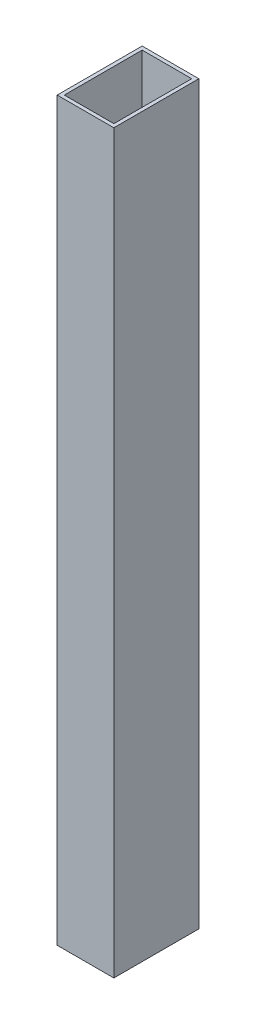
ISO-10303-21;
HEADER;
FILE_DESCRIPTION(('STEP AP214'),'2;1');
FILE_NAME('part.step','',(''),(''),'','','');
FILE_SCHEMA(('AUTOMOTIVE_DESIGN { 1 0 10303 214 1 1 1 1 }'));
ENDSEC;
DATA;
#1=APPLICATION_CONTEXT('core data for automotive mechanical design processes');
#2=APPLICATION_PROTOCOL_DEFINITION('international standard','automotive_design',2000,#1);
#3=PRODUCT_CONTEXT('',#1,'mechanical');
#4=PRODUCT('Part','Part','',(#3));
#5=PRODUCT_RELATED_PRODUCT_CATEGORY('part','',(#4));
#6=PRODUCT_DEFINITION_FORMATION('','',#4);
#7=PRODUCT_DEFINITION_CONTEXT('part definition',#1,'design');
#8=PRODUCT_DEFINITION('design','',#6,#7);
#9=PRODUCT_DEFINITION_SHAPE('','',#8);
#10=(LENGTH_UNIT() NAMED_UNIT(*) SI_UNIT(.MILLI.,.METRE.));
#11=(NAMED_UNIT(*) PLANE_ANGLE_UNIT() SI_UNIT($,.RADIAN.));
#12=(NAMED_UNIT(*) SI_UNIT($,.STERADIAN.) SOLID_ANGLE_UNIT());
#13=UNCERTAINTY_MEASURE_WITH_UNIT(LENGTH_MEASURE(1.E-05),#10,'distance_accuracy_value','');
#14=(GEOMETRIC_REPRESENTATION_CONTEXT(3) GLOBAL_UNCERTAINTY_ASSIGNED_CONTEXT((#13)) GLOBAL_UNIT_ASSIGNED_CONTEXT((#10,
#11,#12)) REPRESENTATION_CONTEXT('',''));
#15=CARTESIAN_POINT('',(0.,0.,0.));
#16=DIRECTION('',(0.,0.,1.));
#17=DIRECTION('',(1.,0.,0.));
#18=AXIS2_PLACEMENT_3D('',#15,#16,#17);
#19=CARTESIAN_POINT('',(25.4,660.4,-38.1));
#20=DIRECTION('',(-1.,0.,0.));
#21=DIRECTION('',(0.,0.,1.));
#22=AXIS2_PLACEMENT_3D('',#19,#20,#21);
#23=PLANE('',#22);
#24=DIRECTION('',(0.,0.,-1.));
#25=VECTOR('',#24,1.);
#26=CARTESIAN_POINT('',(25.4,0.,-38.1));
#27=LINE('',#26,#25);
#28=CARTESIAN_POINT('',(25.4,0.,38.1));
#29=VERTEX_POINT('',#28);
#30=CARTESIAN_POINT('',(25.4,0.,-38.1));
#31=VERTEX_POINT('',#30);
#32=EDGE_CURVE('E145',#29,#31,#27,.T.);
#33=ORIENTED_EDGE('',*,*,#32,.T.);
#34=DIRECTION('',(0.,-1.,0.));
#35=VECTOR('',#34,1.);
#36=CARTESIAN_POINT('',(25.4,660.4,-38.1));
#37=LINE('',#36,#35);
#38=CARTESIAN_POINT('',(25.4,660.4,-38.1));
#39=VERTEX_POINT('',#38);
#40=EDGE_CURVE('E11',#39,#31,#37,.T.);
#41=ORIENTED_EDGE('',*,*,#40,.F.);
#42=DIRECTION('',(0.,0.,-1.));
#43=VECTOR('',#42,1.);
#44=CARTESIAN_POINT('',(25.4,660.4,-38.1));
#45=LINE('',#44,#43);
#46=CARTESIAN_POINT('',(25.4,660.4,38.1));
#47=VERTEX_POINT('',#46);
#48=EDGE_CURVE('E134',#47,#39,#45,.T.);
#49=ORIENTED_EDGE('',*,*,#48,.F.);
#50=DIRECTION('',(0.,-1.,0.));
#51=VECTOR('',#50,1.);
#52=CARTESIAN_POINT('',(25.4,660.4,38.1));
#53=LINE('',#52,#51);
#54=EDGE_CURVE('E144',#47,#29,#53,.T.);
#55=ORIENTED_EDGE('',*,*,#54,.T.);
#56=EDGE_LOOP('',(#33,#41,#49,#55));
#57=FACE_BOUND('',#56,.T.);
#58=ADVANCED_FACE('F37',(#57),#23,.F.);
#59=CARTESIAN_POINT('',(-25.4,660.4,-38.1));
#60=DIRECTION('',(0.,0.,1.));
#61=DIRECTION('',(1.,0.,0.));
#62=AXIS2_PLACEMENT_3D('',#59,#60,#61);
#63=PLANE('',#62);
#64=DIRECTION('',(-1.,0.,0.));
#65=VECTOR('',#64,1.);
#66=CARTESIAN_POINT('',(-25.4,0.,-38.1));
#67=LINE('',#66,#65);
#68=CARTESIAN_POINT('',(-25.4,0.,-38.1));
#69=VERTEX_POINT('',#68);
#70=EDGE_CURVE('E148',#31,#69,#67,.T.);
#71=ORIENTED_EDGE('',*,*,#70,.T.);
#72=DIRECTION('',(0.,-1.,0.));
#73=VECTOR('',#72,1.);
#74=CARTESIAN_POINT('',(-25.4,660.4,-38.1));
#75=LINE('',#74,#73);
#76=CARTESIAN_POINT('',(-25.4,660.4,-38.1));
#77=VERTEX_POINT('',#76);
#78=EDGE_CURVE('E44',#77,#69,#75,.T.);
#79=ORIENTED_EDGE('',*,*,#78,.F.);
#80=DIRECTION('',(-1.,0.,0.));
#81=VECTOR('',#80,1.);
#82=CARTESIAN_POINT('',(-25.4,660.4,-38.1));
#83=LINE('',#82,#81);
#84=EDGE_CURVE('E137',#39,#77,#83,.T.);
#85=ORIENTED_EDGE('',*,*,#84,.F.);
#86=ORIENTED_EDGE('',*,*,#40,.T.);
#87=EDGE_LOOP('',(#71,#79,#85,#86));
#88=FACE_BOUND('',#87,.T.);
#89=ADVANCED_FACE('F176',(#88),#63,.F.);
#90=CARTESIAN_POINT('',(-25.4,660.4,-38.1));
#91=DIRECTION('',(1.,0.,0.));
#92=DIRECTION('',(0.,0.,-1.));
#93=AXIS2_PLACEMENT_3D('',#90,#91,#92);
#94=PLANE('',#93);
#95=DIRECTION('',(0.,0.,1.));
#96=VECTOR('',#95,1.);
#97=CARTESIAN_POINT('',(-25.4,0.,-38.1));
#98=LINE('',#97,#96);
#99=CARTESIAN_POINT('',(-25.4,0.,38.1));
#100=VERTEX_POINT('',#99);
#101=EDGE_CURVE('E150',#69,#100,#98,.T.);
#102=ORIENTED_EDGE('',*,*,#101,.T.);
#103=DIRECTION('',(0.,-1.,0.));
#104=VECTOR('',#103,1.);
#105=CARTESIAN_POINT('',(-25.4,660.4,38.1));
#106=LINE('',#105,#104);
#107=CARTESIAN_POINT('',(-25.4,660.4,38.1));
#108=VERTEX_POINT('',#107);
#109=EDGE_CURVE('E155',#108,#100,#106,.T.);
#110=ORIENTED_EDGE('',*,*,#109,.F.);
#111=DIRECTION('',(0.,0.,1.));
#112=VECTOR('',#111,1.);
#113=CARTESIAN_POINT('',(-25.4,660.4,-38.1));
#114=LINE('',#113,#112);
#115=EDGE_CURVE('E140',#77,#108,#114,.T.);
#116=ORIENTED_EDGE('',*,*,#115,.F.);
#117=ORIENTED_EDGE('',*,*,#78,.T.);
#118=EDGE_LOOP('',(#102,#110,#116,#117));
#119=FACE_BOUND('',#118,.T.);
#120=ADVANCED_FACE('F162',(#119),#94,.F.);
#121=CARTESIAN_POINT('',(-25.4,660.4,38.1));
#122=DIRECTION('',(0.,0.,-1.));
#123=DIRECTION('',(-1.,0.,0.));
#124=AXIS2_PLACEMENT_3D('',#121,#122,#123);
#125=PLANE('',#124);
#126=DIRECTION('',(1.,0.,0.));
#127=VECTOR('',#126,1.);
#128=CARTESIAN_POINT('',(-25.4,0.,38.1));
#129=LINE('',#128,#127);
#130=EDGE_CURVE('E138',#100,#29,#129,.T.);
#131=ORIENTED_EDGE('',*,*,#130,.T.);
#132=ORIENTED_EDGE('',*,*,#54,.F.);
#133=DIRECTION('',(1.,0.,0.));
#134=VECTOR('',#133,1.);
#135=CARTESIAN_POINT('',(-25.4,660.4,38.1));
#136=LINE('',#135,#134);
#137=EDGE_CURVE('E142',#108,#47,#136,.T.);
#138=ORIENTED_EDGE('',*,*,#137,.F.);
#139=ORIENTED_EDGE('',*,*,#109,.T.);
#140=EDGE_LOOP('',(#131,#132,#138,#139));
#141=FACE_BOUND('',#140,.T.);
#142=ADVANCED_FACE('F169',(#141),#125,.F.);
#143=CARTESIAN_POINT('',(0.,660.4,0.));
#144=DIRECTION('',(0.,1.,0.));
#145=DIRECTION('',(0.,0.,1.));
#146=AXIS2_PLACEMENT_3D('',#143,#144,#145);
#147=PLANE('',#146);
#148=DIRECTION('',(0.,0.,-1.));
#149=VECTOR('',#148,1.);
#150=CARTESIAN_POINT('',(22.225,660.4,-38.1));
#151=LINE('',#150,#149);
#152=CARTESIAN_POINT('',(22.225,660.4,34.925));
#153=VERTEX_POINT('',#152);
#154=CARTESIAN_POINT('',(22.225,660.4,-34.925));
#155=VERTEX_POINT('',#154);
#156=EDGE_CURVE('E122',#153,#155,#151,.T.);
#157=ORIENTED_EDGE('',*,*,#156,.F.);
#158=DIRECTION('',(1.,0.,0.));
#159=VECTOR('',#158,1.);
#160=CARTESIAN_POINT('',(-25.4,660.4,34.925));
#161=LINE('',#160,#159);
#162=CARTESIAN_POINT('',(-22.225,660.4,34.925));
#163=VERTEX_POINT('',#162);
#164=EDGE_CURVE('E106',#163,#153,#161,.T.);
#165=ORIENTED_EDGE('',*,*,#164,.F.);
#166=DIRECTION('',(0.,0.,1.));
#167=VECTOR('',#166,1.);
#168=CARTESIAN_POINT('',(-22.225,660.4,-38.1));
#169=LINE('',#168,#167);
#170=CARTESIAN_POINT('',(-22.225,660.4,-34.925));
#171=VERTEX_POINT('',#170);
#172=EDGE_CURVE('E131',#171,#163,#169,.T.);
#173=ORIENTED_EDGE('',*,*,#172,.F.);
#174=DIRECTION('',(-1.,0.,0.));
#175=VECTOR('',#174,1.);
#176=CARTESIAN_POINT('',(-25.4,660.4,-34.925));
#177=LINE('',#176,#175);
#178=EDGE_CURVE('E124',#155,#171,#177,.T.);
#179=ORIENTED_EDGE('',*,*,#178,.F.);
#180=EDGE_LOOP('',(#157,#165,#173,#179));
#181=FACE_BOUND('',#180,.T.);
#182=ORIENTED_EDGE('',*,*,#48,.T.);
#183=ORIENTED_EDGE('',*,*,#84,.T.);
#184=ORIENTED_EDGE('',*,*,#115,.T.);
#185=ORIENTED_EDGE('',*,*,#137,.T.);
#186=EDGE_LOOP('',(#182,#183,#184,#185));
#187=FACE_BOUND('',#186,.T.);
#188=ADVANCED_FACE('F175',(#181,#187),#147,.T.);
#189=CARTESIAN_POINT('',(0.,0.,0.));
#190=DIRECTION('',(0.,1.,0.));
#191=DIRECTION('',(0.,0.,1.));
#192=AXIS2_PLACEMENT_3D('',#189,#190,#191);
#193=PLANE('',#192);
#194=DIRECTION('',(1.,0.,0.));
#195=VECTOR('',#194,1.);
#196=CARTESIAN_POINT('',(-25.4,0.,34.925));
#197=LINE('',#196,#195);
#198=CARTESIAN_POINT('',(-22.225,0.,34.925));
#199=VERTEX_POINT('',#198);
#200=CARTESIAN_POINT('',(22.225,0.,34.925));
#201=VERTEX_POINT('',#200);
#202=EDGE_CURVE('E104',#199,#201,#197,.T.);
#203=ORIENTED_EDGE('',*,*,#202,.T.);
#204=DIRECTION('',(0.,0.,-1.));
#205=VECTOR('',#204,1.);
#206=CARTESIAN_POINT('',(22.225,0.,-38.1));
#207=LINE('',#206,#205);
#208=CARTESIAN_POINT('',(22.225,0.,-34.925));
#209=VERTEX_POINT('',#208);
#210=EDGE_CURVE('E112',#201,#209,#207,.T.);
#211=ORIENTED_EDGE('',*,*,#210,.T.);
#212=DIRECTION('',(-1.,0.,0.));
#213=VECTOR('',#212,1.);
#214=CARTESIAN_POINT('',(-25.4,0.,-34.925));
#215=LINE('',#214,#213);
#216=CARTESIAN_POINT('',(-22.225,0.,-34.925));
#217=VERTEX_POINT('',#216);
#218=EDGE_CURVE('E118',#209,#217,#215,.T.);
#219=ORIENTED_EDGE('',*,*,#218,.T.);
#220=DIRECTION('',(0.,0.,1.));
#221=VECTOR('',#220,1.);
#222=CARTESIAN_POINT('',(-22.225,0.,-38.1));
#223=LINE('',#222,#221);
#224=EDGE_CURVE('E58',#217,#199,#223,.T.);
#225=ORIENTED_EDGE('',*,*,#224,.T.);
#226=EDGE_LOOP('',(#203,#211,#219,#225));
#227=FACE_BOUND('',#226,.T.);
#228=ORIENTED_EDGE('',*,*,#32,.F.);
#229=ORIENTED_EDGE('',*,*,#130,.F.);
#230=ORIENTED_EDGE('',*,*,#101,.F.);
#231=ORIENTED_EDGE('',*,*,#70,.F.);
#232=EDGE_LOOP('',(#228,#229,#230,#231));
#233=FACE_BOUND('',#232,.T.);
#234=ADVANCED_FACE('F120',(#227,#233),#193,.F.);
#235=CARTESIAN_POINT('',(22.225,660.4,-38.1));
#236=DIRECTION('',(-1.,0.,0.));
#237=DIRECTION('',(0.,0.,1.));
#238=AXIS2_PLACEMENT_3D('',#235,#236,#237);
#239=PLANE('',#238);
#240=ORIENTED_EDGE('',*,*,#210,.F.);
#241=DIRECTION('',(0.,-1.,0.));
#242=VECTOR('',#241,1.);
#243=CARTESIAN_POINT('',(22.225,660.4,34.925));
#244=LINE('',#243,#242);
#245=EDGE_CURVE('E100',#153,#201,#244,.T.);
#246=ORIENTED_EDGE('',*,*,#245,.F.);
#247=ORIENTED_EDGE('',*,*,#156,.T.);
#248=DIRECTION('',(0.,-1.,0.));
#249=VECTOR('',#248,1.);
#250=CARTESIAN_POINT('',(22.225,660.4,-34.925));
#251=LINE('',#250,#249);
#252=EDGE_CURVE('E115',#155,#209,#251,.T.);
#253=ORIENTED_EDGE('',*,*,#252,.T.);
#254=EDGE_LOOP('',(#240,#246,#247,#253));
#255=FACE_BOUND('',#254,.T.);
#256=ADVANCED_FACE('F113',(#255),#239,.T.);
#257=CARTESIAN_POINT('',(-25.4,660.4,-34.925));
#258=DIRECTION('',(0.,0.,1.));
#259=DIRECTION('',(1.,0.,0.));
#260=AXIS2_PLACEMENT_3D('',#257,#258,#259);
#261=PLANE('',#260);
#262=ORIENTED_EDGE('',*,*,#218,.F.);
#263=ORIENTED_EDGE('',*,*,#252,.F.);
#264=ORIENTED_EDGE('',*,*,#178,.T.);
#265=DIRECTION('',(0.,-1.,0.));
#266=VECTOR('',#265,1.);
#267=CARTESIAN_POINT('',(-22.225,660.4,-34.925));
#268=LINE('',#267,#266);
#269=EDGE_CURVE('E280',#171,#217,#268,.T.);
#270=ORIENTED_EDGE('',*,*,#269,.T.);
#271=EDGE_LOOP('',(#262,#263,#264,#270));
#272=FACE_BOUND('',#271,.T.);
#273=ADVANCED_FACE('F196',(#272),#261,.T.);
#274=CARTESIAN_POINT('',(-22.225,660.4,-38.1));
#275=DIRECTION('',(1.,0.,0.));
#276=DIRECTION('',(0.,0.,-1.));
#277=AXIS2_PLACEMENT_3D('',#274,#275,#276);
#278=PLANE('',#277);
#279=ORIENTED_EDGE('',*,*,#224,.F.);
#280=ORIENTED_EDGE('',*,*,#269,.F.);
#281=ORIENTED_EDGE('',*,*,#172,.T.);
#282=DIRECTION('',(0.,-1.,0.));
#283=VECTOR('',#282,1.);
#284=CARTESIAN_POINT('',(-22.225,660.4,34.925));
#285=LINE('',#284,#283);
#286=EDGE_CURVE('E51',#163,#199,#285,.T.);
#287=ORIENTED_EDGE('',*,*,#286,.T.);
#288=EDGE_LOOP('',(#279,#280,#281,#287));
#289=FACE_BOUND('',#288,.T.);
#290=ADVANCED_FACE('F193',(#289),#278,.T.);
#291=CARTESIAN_POINT('',(-25.4,660.4,34.925));
#292=DIRECTION('',(0.,0.,-1.));
#293=DIRECTION('',(-1.,0.,0.));
#294=AXIS2_PLACEMENT_3D('',#291,#292,#293);
#295=PLANE('',#294);
#296=ORIENTED_EDGE('',*,*,#202,.F.);
#297=ORIENTED_EDGE('',*,*,#286,.F.);
#298=ORIENTED_EDGE('',*,*,#164,.T.);
#299=ORIENTED_EDGE('',*,*,#245,.T.);
#300=EDGE_LOOP('',(#296,#297,#298,#299));
#301=FACE_BOUND('',#300,.T.);
#302=ADVANCED_FACE('F102',(#301),#295,.T.);
#303=CLOSED_SHELL('',(#58,#89,#120,#142,#188,#234,#256,#273,#290,#302));
#304=MANIFOLD_SOLID_BREP('B2',#303);
#305=ADVANCED_BREP_SHAPE_REPRESENTATION('',(#18,#304),#14);
#306=SHAPE_DEFINITION_REPRESENTATION(#9,#305);
ENDSEC;
END-ISO-10303-21;
